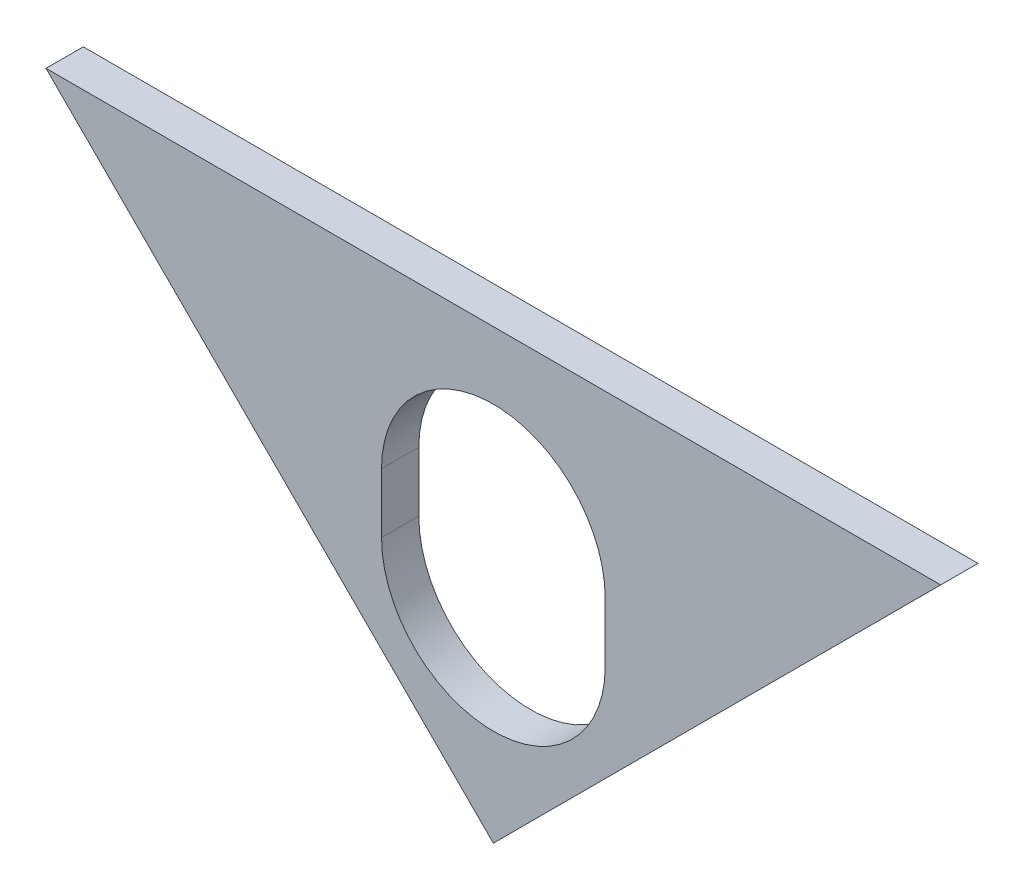
ISO-10303-21;
HEADER;
FILE_DESCRIPTION(('STEP AP214'),'2;1');
FILE_NAME('part.step','',(''),(''),'','','');
FILE_SCHEMA(('AUTOMOTIVE_DESIGN { 1 0 10303 214 1 1 1 1 }'));
ENDSEC;
DATA;
#1=APPLICATION_CONTEXT('core data for automotive mechanical design processes');
#2=APPLICATION_PROTOCOL_DEFINITION('international standard','automotive_design',2000,#1);
#3=PRODUCT_CONTEXT('',#1,'mechanical');
#4=PRODUCT('Part','Part','',(#3));
#5=PRODUCT_RELATED_PRODUCT_CATEGORY('part','',(#4));
#6=PRODUCT_DEFINITION_FORMATION('','',#4);
#7=PRODUCT_DEFINITION_CONTEXT('part definition',#1,'design');
#8=PRODUCT_DEFINITION('design','',#6,#7);
#9=PRODUCT_DEFINITION_SHAPE('','',#8);
#10=(LENGTH_UNIT() NAMED_UNIT(*) SI_UNIT(.MILLI.,.METRE.));
#11=(NAMED_UNIT(*) PLANE_ANGLE_UNIT() SI_UNIT($,.RADIAN.));
#12=(NAMED_UNIT(*) SI_UNIT($,.STERADIAN.) SOLID_ANGLE_UNIT());
#13=UNCERTAINTY_MEASURE_WITH_UNIT(LENGTH_MEASURE(1.E-05),#10,'distance_accuracy_value','');
#14=(GEOMETRIC_REPRESENTATION_CONTEXT(3) GLOBAL_UNCERTAINTY_ASSIGNED_CONTEXT((#13)) GLOBAL_UNIT_ASSIGNED_CONTEXT((#10,
#11,#12)) REPRESENTATION_CONTEXT('',''));
#15=CARTESIAN_POINT('',(0.,0.,0.));
#16=DIRECTION('',(0.,0.,1.));
#17=DIRECTION('',(1.,0.,0.));
#18=AXIS2_PLACEMENT_3D('',#15,#16,#17);
#19=CARTESIAN_POINT('',(0.,45.72,0.));
#20=DIRECTION('',(0.,0.,-1.));
#21=DIRECTION('',(0.,-1.,0.));
#22=AXIS2_PLACEMENT_3D('',#19,#20,#21);
#23=CYLINDRICAL_SURFACE('',#22,19.05);
#24=CARTESIAN_POINT('',(0.,45.72,-6.35));
#25=DIRECTION('',(0.,0.,1.));
#26=DIRECTION('',(1.,0.,0.));
#27=AXIS2_PLACEMENT_3D('',#24,#25,#26);
#28=CIRCLE('',#27,19.05);
#29=CARTESIAN_POINT('',(19.05,45.72,-6.35));
#30=VERTEX_POINT('',#29);
#31=CARTESIAN_POINT('',(-19.05,45.72,-6.35));
#32=VERTEX_POINT('',#31);
#33=EDGE_CURVE('E34',#30,#32,#28,.T.);
#34=ORIENTED_EDGE('',*,*,#33,.F.);
#35=DIRECTION('',(0.,0.,-1.));
#36=VECTOR('',#35,1.);
#37=CARTESIAN_POINT('',(19.05,45.72,0.));
#38=LINE('',#37,#36);
#39=CARTESIAN_POINT('',(19.05,45.72,0.));
#40=VERTEX_POINT('',#39);
#41=EDGE_CURVE('E104',#40,#30,#38,.T.);
#42=ORIENTED_EDGE('',*,*,#41,.F.);
#43=CARTESIAN_POINT('',(0.,45.72,0.));
#44=DIRECTION('',(0.,0.,-1.));
#45=DIRECTION('',(0.,-1.,0.));
#46=AXIS2_PLACEMENT_3D('',#43,#44,#45);
#47=CIRCLE('',#46,19.05);
#48=CARTESIAN_POINT('',(-19.05,45.72,0.));
#49=VERTEX_POINT('',#48);
#50=EDGE_CURVE('E112',#49,#40,#47,.T.);
#51=ORIENTED_EDGE('',*,*,#50,.F.);
#52=DIRECTION('',(0.,0.,-1.));
#53=VECTOR('',#52,1.);
#54=CARTESIAN_POINT('',(-19.05,45.72,0.));
#55=LINE('',#54,#53);
#56=EDGE_CURVE('E10',#49,#32,#55,.T.);
#57=ORIENTED_EDGE('',*,*,#56,.T.);
#58=EDGE_LOOP('',(#34,#42,#51,#57));
#59=FACE_BOUND('',#58,.T.);
#60=ADVANCED_FACE('F16',(#59),#23,.F.);
#61=CARTESIAN_POINT('',(-19.05,35.56,0.));
#62=DIRECTION('',(-1.,0.,0.));
#63=DIRECTION('',(0.,0.,1.));
#64=AXIS2_PLACEMENT_3D('',#61,#62,#63);
#65=PLANE('',#64);
#66=DIRECTION('',(0.,-1.,0.));
#67=VECTOR('',#66,1.);
#68=CARTESIAN_POINT('',(-19.05,45.72,-6.35));
#69=LINE('',#68,#67);
#70=CARTESIAN_POINT('',(-19.05,35.56,-6.35));
#71=VERTEX_POINT('',#70);
#72=EDGE_CURVE('E122',#32,#71,#69,.T.);
#73=ORIENTED_EDGE('',*,*,#72,.F.);
#74=ORIENTED_EDGE('',*,*,#56,.F.);
#75=DIRECTION('',(0.,1.,0.));
#76=VECTOR('',#75,1.);
#77=CARTESIAN_POINT('',(-19.05,35.56,0.));
#78=LINE('',#77,#76);
#79=CARTESIAN_POINT('',(-19.05,35.56,0.));
#80=VERTEX_POINT('',#79);
#81=EDGE_CURVE('E123',#80,#49,#78,.T.);
#82=ORIENTED_EDGE('',*,*,#81,.F.);
#83=DIRECTION('',(0.,0.,-1.));
#84=VECTOR('',#83,1.);
#85=CARTESIAN_POINT('',(-19.05,35.56,0.));
#86=LINE('',#85,#84);
#87=EDGE_CURVE('E26',#80,#71,#86,.T.);
#88=ORIENTED_EDGE('',*,*,#87,.T.);
#89=EDGE_LOOP('',(#73,#74,#82,#88));
#90=FACE_BOUND('',#89,.T.);
#91=ADVANCED_FACE('F136',(#90),#65,.F.);
#92=CARTESIAN_POINT('',(0.,35.56,0.));
#93=DIRECTION('',(0.,0.,-1.));
#94=DIRECTION('',(0.,-1.,0.));
#95=AXIS2_PLACEMENT_3D('',#92,#93,#94);
#96=CYLINDRICAL_SURFACE('',#95,19.05);
#97=CARTESIAN_POINT('',(0.,35.56,-6.35));
#98=DIRECTION('',(0.,0.,1.));
#99=DIRECTION('',(1.,0.,0.));
#100=AXIS2_PLACEMENT_3D('',#97,#98,#99);
#101=CIRCLE('',#100,19.05);
#102=CARTESIAN_POINT('',(19.05,35.56,-6.35));
#103=VERTEX_POINT('',#102);
#104=EDGE_CURVE('E95',#71,#103,#101,.T.);
#105=ORIENTED_EDGE('',*,*,#104,.F.);
#106=ORIENTED_EDGE('',*,*,#87,.F.);
#107=CARTESIAN_POINT('',(0.,35.56,0.));
#108=DIRECTION('',(0.,0.,-1.));
#109=DIRECTION('',(0.,-1.,0.));
#110=AXIS2_PLACEMENT_3D('',#107,#108,#109);
#111=CIRCLE('',#110,19.05);
#112=CARTESIAN_POINT('',(19.05,35.56,0.));
#113=VERTEX_POINT('',#112);
#114=EDGE_CURVE('E119',#113,#80,#111,.T.);
#115=ORIENTED_EDGE('',*,*,#114,.F.);
#116=DIRECTION('',(0.,0.,-1.));
#117=VECTOR('',#116,1.);
#118=CARTESIAN_POINT('',(19.05,35.56,0.));
#119=LINE('',#118,#117);
#120=EDGE_CURVE('E116',#113,#103,#119,.T.);
#121=ORIENTED_EDGE('',*,*,#120,.T.);
#122=EDGE_LOOP('',(#105,#106,#115,#121));
#123=FACE_BOUND('',#122,.T.);
#124=ADVANCED_FACE('F18',(#123),#96,.F.);
#125=CARTESIAN_POINT('',(19.05,45.72,0.));
#126=DIRECTION('',(1.,0.,0.));
#127=DIRECTION('',(0.,0.,-1.));
#128=AXIS2_PLACEMENT_3D('',#125,#126,#127);
#129=PLANE('',#128);
#130=DIRECTION('',(0.,1.,0.));
#131=VECTOR('',#130,1.);
#132=CARTESIAN_POINT('',(19.05,35.56,-6.35));
#133=LINE('',#132,#131);
#134=EDGE_CURVE('E113',#103,#30,#133,.T.);
#135=ORIENTED_EDGE('',*,*,#134,.F.);
#136=ORIENTED_EDGE('',*,*,#120,.F.);
#137=DIRECTION('',(0.,-1.,0.));
#138=VECTOR('',#137,1.);
#139=CARTESIAN_POINT('',(19.05,45.72,0.));
#140=LINE('',#139,#138);
#141=EDGE_CURVE('E109',#40,#113,#140,.T.);
#142=ORIENTED_EDGE('',*,*,#141,.F.);
#143=ORIENTED_EDGE('',*,*,#41,.T.);
#144=EDGE_LOOP('',(#135,#136,#142,#143));
#145=FACE_BOUND('',#144,.T.);
#146=ADVANCED_FACE('F143',(#145),#129,.F.);
#147=CARTESIAN_POINT('',(76.2,76.2,0.));
#148=DIRECTION('',(0.707106781186548,-0.707106781186548,0.));
#149=DIRECTION('',(0.707106781186548,0.707106781186548,0.));
#150=AXIS2_PLACEMENT_3D('',#147,#148,#149);
#151=PLANE('',#150);
#152=DIRECTION('',(-0.707106781186548,-0.707106781186548,0.));
#153=VECTOR('',#152,1.);
#154=CARTESIAN_POINT('',(76.2,76.2,0.));
#155=LINE('',#154,#153);
#156=CARTESIAN_POINT('',(76.2,76.2,0.));
#157=VERTEX_POINT('',#156);
#158=CARTESIAN_POINT('',(0.,0.,0.));
#159=VERTEX_POINT('',#158);
#160=EDGE_CURVE('E101',#157,#159,#155,.T.);
#161=ORIENTED_EDGE('',*,*,#160,.T.);
#162=DIRECTION('',(0.,0.,-1.));
#163=VECTOR('',#162,1.);
#164=CARTESIAN_POINT('',(0.,0.,0.));
#165=LINE('',#164,#163);
#166=CARTESIAN_POINT('',(0.,0.,-6.35));
#167=VERTEX_POINT('',#166);
#168=EDGE_CURVE('E98',#159,#167,#165,.T.);
#169=ORIENTED_EDGE('',*,*,#168,.T.);
#170=DIRECTION('',(-0.707106781186548,-0.707106781186548,0.));
#171=VECTOR('',#170,1.);
#172=CARTESIAN_POINT('',(76.2,76.2,-6.35));
#173=LINE('',#172,#171);
#174=CARTESIAN_POINT('',(76.2,76.2,-6.35));
#175=VERTEX_POINT('',#174);
#176=EDGE_CURVE('E82',#175,#167,#173,.T.);
#177=ORIENTED_EDGE('',*,*,#176,.F.);
#178=DIRECTION('',(0.,0.,-1.));
#179=VECTOR('',#178,1.);
#180=CARTESIAN_POINT('',(76.2,76.2,0.));
#181=LINE('',#180,#179);
#182=EDGE_CURVE('E79',#157,#175,#181,.T.);
#183=ORIENTED_EDGE('',*,*,#182,.F.);
#184=EDGE_LOOP('',(#161,#169,#177,#183));
#185=FACE_BOUND('',#184,.T.);
#186=ADVANCED_FACE('F99',(#185),#151,.T.);
#187=CARTESIAN_POINT('',(-76.2,76.2,0.));
#188=DIRECTION('',(0.,1.,0.));
#189=DIRECTION('',(0.,0.,1.));
#190=AXIS2_PLACEMENT_3D('',#187,#188,#189);
#191=PLANE('',#190);
#192=DIRECTION('',(1.,0.,0.));
#193=VECTOR('',#192,1.);
#194=CARTESIAN_POINT('',(-76.2,76.2,0.));
#195=LINE('',#194,#193);
#196=CARTESIAN_POINT('',(-76.2,76.2,0.));
#197=VERTEX_POINT('',#196);
#198=EDGE_CURVE('E102',#197,#157,#195,.T.);
#199=ORIENTED_EDGE('',*,*,#198,.T.);
#200=ORIENTED_EDGE('',*,*,#182,.T.);
#201=DIRECTION('',(1.,0.,0.));
#202=VECTOR('',#201,1.);
#203=CARTESIAN_POINT('',(-76.2,76.2,-6.35));
#204=LINE('',#203,#202);
#205=CARTESIAN_POINT('',(-76.2,76.2,-6.35));
#206=VERTEX_POINT('',#205);
#207=EDGE_CURVE('E77',#206,#175,#204,.T.);
#208=ORIENTED_EDGE('',*,*,#207,.F.);
#209=DIRECTION('',(0.,0.,-1.));
#210=VECTOR('',#209,1.);
#211=CARTESIAN_POINT('',(-76.2,76.2,0.));
#212=LINE('',#211,#210);
#213=EDGE_CURVE('E73',#197,#206,#212,.T.);
#214=ORIENTED_EDGE('',*,*,#213,.F.);
#215=EDGE_LOOP('',(#199,#200,#208,#214));
#216=FACE_BOUND('',#215,.T.);
#217=ADVANCED_FACE('F78',(#216),#191,.T.);
#218=CARTESIAN_POINT('',(0.,0.,0.));
#219=DIRECTION('',(-0.707106781186548,-0.707106781186548,0.));
#220=DIRECTION('',(0.707106781186548,-0.707106781186548,0.));
#221=AXIS2_PLACEMENT_3D('',#218,#219,#220);
#222=PLANE('',#221);
#223=DIRECTION('',(-0.707106781186548,0.707106781186548,0.));
#224=VECTOR('',#223,1.);
#225=CARTESIAN_POINT('',(0.,0.,0.));
#226=LINE('',#225,#224);
#227=EDGE_CURVE('E89',#159,#197,#226,.T.);
#228=ORIENTED_EDGE('',*,*,#227,.T.);
#229=ORIENTED_EDGE('',*,*,#213,.T.);
#230=DIRECTION('',(-0.707106781186548,0.707106781186548,0.));
#231=VECTOR('',#230,1.);
#232=CARTESIAN_POINT('',(0.,0.,-6.35));
#233=LINE('',#232,#231);
#234=EDGE_CURVE('E20',#167,#206,#233,.T.);
#235=ORIENTED_EDGE('',*,*,#234,.F.);
#236=ORIENTED_EDGE('',*,*,#168,.F.);
#237=EDGE_LOOP('',(#228,#229,#235,#236));
#238=FACE_BOUND('',#237,.T.);
#239=ADVANCED_FACE('F87',(#238),#222,.T.);
#240=CARTESIAN_POINT('',(0.,53.8815367264149,-6.35));
#241=DIRECTION('',(0.,0.,1.));
#242=DIRECTION('',(1.,0.,0.));
#243=AXIS2_PLACEMENT_3D('',#240,#241,#242);
#244=PLANE('',#243);
#245=ORIENTED_EDGE('',*,*,#234,.T.);
#246=ORIENTED_EDGE('',*,*,#207,.T.);
#247=ORIENTED_EDGE('',*,*,#176,.T.);
#248=EDGE_LOOP('',(#245,#246,#247));
#249=FACE_BOUND('',#248,.T.);
#250=ORIENTED_EDGE('',*,*,#104,.T.);
#251=ORIENTED_EDGE('',*,*,#134,.T.);
#252=ORIENTED_EDGE('',*,*,#33,.T.);
#253=ORIENTED_EDGE('',*,*,#72,.T.);
#254=EDGE_LOOP('',(#250,#251,#252,#253));
#255=FACE_BOUND('',#254,.T.);
#256=ADVANCED_FACE('F91',(#249,#255),#244,.F.);
#257=CARTESIAN_POINT('',(0.,53.8815367264149,0.));
#258=DIRECTION('',(0.,0.,1.));
#259=DIRECTION('',(1.,0.,0.));
#260=AXIS2_PLACEMENT_3D('',#257,#258,#259);
#261=PLANE('',#260);
#262=ORIENTED_EDGE('',*,*,#227,.F.);
#263=ORIENTED_EDGE('',*,*,#160,.F.);
#264=ORIENTED_EDGE('',*,*,#198,.F.);
#265=EDGE_LOOP('',(#262,#263,#264));
#266=FACE_BOUND('',#265,.T.);
#267=ORIENTED_EDGE('',*,*,#114,.T.);
#268=ORIENTED_EDGE('',*,*,#81,.T.);
#269=ORIENTED_EDGE('',*,*,#50,.T.);
#270=ORIENTED_EDGE('',*,*,#141,.T.);
#271=EDGE_LOOP('',(#267,#268,#269,#270));
#272=FACE_BOUND('',#271,.T.);
#273=ADVANCED_FACE('F145',(#266,#272),#261,.T.);
#274=CLOSED_SHELL('',(#60,#91,#124,#146,#186,#217,#239,#256,#273));
#275=MANIFOLD_SOLID_BREP('B1',#274);
#276=ADVANCED_BREP_SHAPE_REPRESENTATION('',(#18,#275),#14);
#277=SHAPE_DEFINITION_REPRESENTATION(#9,#276);
ENDSEC;
END-ISO-10303-21;
